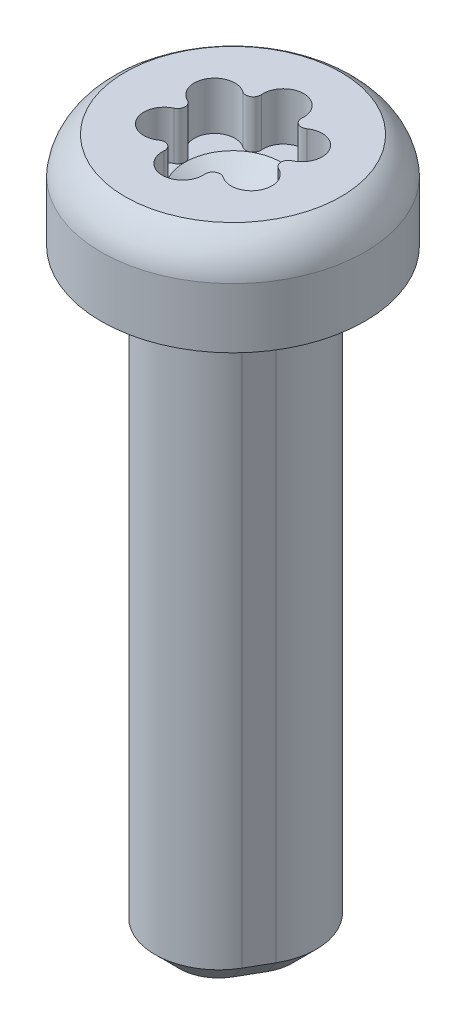
ISO-10303-21;
HEADER;
FILE_DESCRIPTION(('STEP AP214'),'2;1');
FILE_NAME('part.step','',(''),(''),'','','');
FILE_SCHEMA(('AUTOMOTIVE_DESIGN { 1 0 10303 214 1 1 1 1 }'));
ENDSEC;
DATA;
#1=APPLICATION_CONTEXT('core data for automotive mechanical design processes');
#2=APPLICATION_PROTOCOL_DEFINITION('international standard','automotive_design',2000,#1);
#3=PRODUCT_CONTEXT('',#1,'mechanical');
#4=PRODUCT('Part','Part','',(#3));
#5=PRODUCT_RELATED_PRODUCT_CATEGORY('part','',(#4));
#6=PRODUCT_DEFINITION_FORMATION('','',#4);
#7=PRODUCT_DEFINITION_CONTEXT('part definition',#1,'design');
#8=PRODUCT_DEFINITION('design','',#6,#7);
#9=PRODUCT_DEFINITION_SHAPE('','',#8);
#10=(LENGTH_UNIT() NAMED_UNIT(*) SI_UNIT(.MILLI.,.METRE.));
#11=(NAMED_UNIT(*) PLANE_ANGLE_UNIT() SI_UNIT($,.RADIAN.));
#12=(NAMED_UNIT(*) SI_UNIT($,.STERADIAN.) SOLID_ANGLE_UNIT());
#13=UNCERTAINTY_MEASURE_WITH_UNIT(LENGTH_MEASURE(1.E-05),#10,'distance_accuracy_value','');
#14=(GEOMETRIC_REPRESENTATION_CONTEXT(3) GLOBAL_UNCERTAINTY_ASSIGNED_CONTEXT((#13)) GLOBAL_UNIT_ASSIGNED_CONTEXT((#10,
#11,#12)) REPRESENTATION_CONTEXT('',''));
#15=CARTESIAN_POINT('',(0.,0.,0.));
#16=DIRECTION('',(0.,0.,1.));
#17=DIRECTION('',(1.,0.,0.));
#18=AXIS2_PLACEMENT_3D('',#15,#16,#17);
#19=CARTESIAN_POINT('',(0.,-1.13686739848977E-10,0.));
#20=DIRECTION('',(0.,1.,0.));
#21=DIRECTION('',(0.,0.,1.));
#22=AXIS2_PLACEMENT_3D('',#19,#20,#21);
#23=CONICAL_SURFACE('',#22,0.507999999911135,1.0297442581157);
#24=CARTESIAN_POINT('',(0.,-0.30523719459552,0.));
#25=VERTEX_POINT('',#24);
#26=VERTEX_LOOP('',#25);
#27=FACE_BOUND('',#26,.T.);
#28=CARTESIAN_POINT('',(0.,-4.5376796073484E-11,0.));
#29=DIRECTION('',(0.,1.,0.));
#30=DIRECTION('',(0.,0.,1.));
#31=AXIS2_PLACEMENT_3D('',#28,#29,#30);
#32=CIRCLE('',#31,0.508000000024822);
#33=CARTESIAN_POINT('',(0.508000000012404,-2.84168347221045E-11,1.76987610803073E-13));
#34=VERTEX_POINT('',#33);
#35=CARTESIAN_POINT('',(0.254000000006177,-2.26857052065988E-11,0.439940905133282));
#36=VERTEX_POINT('',#35);
#37=EDGE_CURVE('E195',#34,#36,#32,.F.);
#38=ORIENTED_EDGE('',*,*,#37,.F.);
#39=CARTESIAN_POINT('',(0.,-4.5376796073484E-11,0.));
#40=DIRECTION('',(0.,1.,0.));
#41=DIRECTION('',(0.,0.,1.));
#42=AXIS2_PLACEMENT_3D('',#39,#40,#41);
#43=CIRCLE('',#42,0.508000000024822);
#44=CARTESIAN_POINT('',(0.254000000006261,-2.26884398453516E-11,-0.439940905133193));
#45=VERTEX_POINT('',#44);
#46=EDGE_CURVE('E221',#45,#34,#43,.F.);
#47=ORIENTED_EDGE('',*,*,#46,.F.);
#48=CARTESIAN_POINT('',(0.,-4.5376730928045E-11,0.));
#49=DIRECTION('',(0.,1.,0.));
#50=DIRECTION('',(0.,0.,1.));
#51=AXIS2_PLACEMENT_3D('',#48,#49,#50);
#52=CIRCLE('',#51,0.508000000024822);
#53=CARTESIAN_POINT('',(-0.253999999983999,-3.0287031467854E-11,-0.439940905094758));
#54=VERTEX_POINT('',#53);
#55=EDGE_CURVE('E218',#54,#45,#52,.F.);
#56=ORIENTED_EDGE('',*,*,#55,.F.);
#57=CARTESIAN_POINT('',(0.,-1.13686739848977E-10,0.));
#58=DIRECTION('',(0.,1.,0.));
#59=DIRECTION('',(0.,0.,1.));
#60=AXIS2_PLACEMENT_3D('',#57,#58,#59);
#61=CIRCLE('',#60,0.507999999911135);
#62=CARTESIAN_POINT('',(-0.507999999911135,-8.82961703532376E-11,0.));
#63=VERTEX_POINT('',#62);
#64=EDGE_CURVE('E172',#63,#54,#61,.F.);
#65=ORIENTED_EDGE('',*,*,#64,.F.);
#66=CARTESIAN_POINT('',(0.,-4.5376796073484E-11,0.));
#67=DIRECTION('',(0.,1.,0.));
#68=DIRECTION('',(0.,0.,1.));
#69=AXIS2_PLACEMENT_3D('',#66,#67,#68);
#70=CIRCLE('',#69,0.508000000024822);
#71=CARTESIAN_POINT('',(-0.25400000000622,-2.26827183768354E-11,0.439940905133266));
#72=VERTEX_POINT('',#71);
#73=EDGE_CURVE('E18',#72,#63,#70,.F.);
#74=ORIENTED_EDGE('',*,*,#73,.F.);
#75=CARTESIAN_POINT('',(0.,-4.5376796073484E-11,0.));
#76=DIRECTION('',(0.,1.,0.));
#77=DIRECTION('',(0.,0.,1.));
#78=AXIS2_PLACEMENT_3D('',#75,#76,#77);
#79=CIRCLE('',#78,0.508000000024822);
#80=EDGE_CURVE('E169',#36,#72,#79,.F.);
#81=ORIENTED_EDGE('',*,*,#80,.F.);
#82=EDGE_LOOP('',(#38,#47,#56,#65,#74,#81));
#83=FACE_BOUND('',#82,.T.);
#84=ADVANCED_FACE('F15',(#27,#83),#23,.F.);
#85=CARTESIAN_POINT('',(-0.146605300490809,0.,-0.520627829108847));
#86=DIRECTION('',(0.,1.,0.));
#87=DIRECTION('',(-1.,0.,0.));
#88=AXIS2_PLACEMENT_3D('',#85,#86,#87);
#89=PLANE('',#88);
#90=CARTESIAN_POINT('',(-0.461937950378643,0.,0.266700000000102));
#91=DIRECTION('',(0.,1.,0.));
#92=DIRECTION('',(0.,0.,1.));
#93=AXIS2_PLACEMENT_3D('',#90,#91,#92);
#94=CIRCLE('',#93,0.215900000000003);
#95=CARTESIAN_POINT('',(-0.553252928157447,0.,0.0710615967321304));
#96=VERTEX_POINT('',#95);
#97=CARTESIAN_POINT('',(-0.338167612082153,0.,0.443600292136563));
#98=VERTEX_POINT('',#97);
#99=EDGE_CURVE('E180',#96,#98,#94,.T.);
#100=ORIENTED_EDGE('',*,*,#99,.T.);
#101=CARTESIAN_POINT('',(-0.293210600981628,0.,0.507855658218009));
#102=DIRECTION('',(0.,1.,0.));
#103=DIRECTION('',(0.,0.,1.));
#104=AXIS2_PLACEMENT_3D('',#101,#102,#103);
#105=CIRCLE('',#104,0.0784212019632229);
#106=EDGE_CURVE('E178',#72,#98,#105,.T.);
#107=ORIENTED_EDGE('',*,*,#106,.F.);
#108=ORIENTED_EDGE('',*,*,#73,.T.);
#109=CARTESIAN_POINT('',(-0.586421201963143,0.,1.31838984174237E-13));
#110=DIRECTION('',(0.,1.,0.));
#111=DIRECTION('',(0.,0.,1.));
#112=AXIS2_PLACEMENT_3D('',#109,#110,#111);
#113=CIRCLE('',#112,0.0784212019632229);
#114=EDGE_CURVE('E209',#96,#63,#113,.T.);
#115=ORIENTED_EDGE('',*,*,#114,.F.);
#116=EDGE_LOOP('',(#100,#107,#108,#115));
#117=FACE_BOUND('',#116,.T.);
#118=ADVANCED_FACE('F179',(#117),#89,.T.);
#119=CARTESIAN_POINT('',(-0.146605300490809,0.,-0.520627829108847));
#120=DIRECTION('',(0.,1.,0.));
#121=DIRECTION('',(-1.,0.,0.));
#122=AXIS2_PLACEMENT_3D('',#119,#120,#121);
#123=PLANE('',#122);
#124=CARTESIAN_POINT('',(0.,0.,0.533400000000139));
#125=DIRECTION('',(0.,1.,0.));
#126=DIRECTION('',(-1.,0.,0.));
#127=AXIS2_PLACEMENT_3D('',#124,#125,#126);
#128=CIRCLE('',#127,0.215900000000003);
#129=CARTESIAN_POINT('',(-0.215085316075352,0.,0.514661888868534));
#130=VERTEX_POINT('',#129);
#131=CARTESIAN_POINT('',(0.21508531607529,0.,0.514661888868584));
#132=VERTEX_POINT('',#131);
#133=EDGE_CURVE('E201',#130,#132,#128,.T.);
#134=ORIENTED_EDGE('',*,*,#133,.T.);
#135=CARTESIAN_POINT('',(0.293210600981579,0.,0.50785565821802));
#136=DIRECTION('',(0.,1.,0.));
#137=DIRECTION('',(0.,0.,1.));
#138=AXIS2_PLACEMENT_3D('',#135,#136,#137);
#139=CIRCLE('',#138,0.0784212019632229);
#140=EDGE_CURVE('E193',#36,#132,#139,.T.);
#141=ORIENTED_EDGE('',*,*,#140,.F.);
#142=ORIENTED_EDGE('',*,*,#80,.T.);
#143=CARTESIAN_POINT('',(-0.293210600981628,0.,0.507855658218009));
#144=DIRECTION('',(0.,1.,0.));
#145=DIRECTION('',(0.,0.,1.));
#146=AXIS2_PLACEMENT_3D('',#143,#144,#145);
#147=CIRCLE('',#146,0.0784212019632229);
#148=EDGE_CURVE('E191',#130,#72,#147,.T.);
#149=ORIENTED_EDGE('',*,*,#148,.F.);
#150=EDGE_LOOP('',(#134,#141,#142,#149));
#151=FACE_BOUND('',#150,.T.);
#152=ADVANCED_FACE('F190',(#151),#123,.T.);
#153=CARTESIAN_POINT('',(-0.146605300490809,0.,-0.520627829108847));
#154=DIRECTION('',(0.,1.,0.));
#155=DIRECTION('',(-1.,0.,0.));
#156=AXIS2_PLACEMENT_3D('',#153,#154,#155);
#157=PLANE('',#156);
#158=CARTESIAN_POINT('',(0.4619379503786,0.,0.26670000000004));
#159=DIRECTION('',(0.,1.,0.));
#160=DIRECTION('',(0.,0.,1.));
#161=AXIS2_PLACEMENT_3D('',#158,#159,#160);
#162=CIRCLE('',#161,0.215900000000003);
#163=CARTESIAN_POINT('',(0.338167612082105,0.,0.443600292136536));
#164=VERTEX_POINT('',#163);
#165=CARTESIAN_POINT('',(0.553252928157513,0.,0.0710615967320641));
#166=VERTEX_POINT('',#165);
#167=EDGE_CURVE('E240',#164,#166,#162,.T.);
#168=ORIENTED_EDGE('',*,*,#167,.T.);
#169=CARTESIAN_POINT('',(0.586421201963208,0.,0.));
#170=DIRECTION('',(0.,1.,0.));
#171=DIRECTION('',(0.,0.,1.));
#172=AXIS2_PLACEMENT_3D('',#169,#170,#171);
#173=CIRCLE('',#172,0.0784212019632229);
#174=EDGE_CURVE('E231',#34,#166,#173,.T.);
#175=ORIENTED_EDGE('',*,*,#174,.F.);
#176=ORIENTED_EDGE('',*,*,#37,.T.);
#177=CARTESIAN_POINT('',(0.293210600981579,0.,0.50785565821802));
#178=DIRECTION('',(0.,1.,0.));
#179=DIRECTION('',(0.,0.,1.));
#180=AXIS2_PLACEMENT_3D('',#177,#178,#179);
#181=CIRCLE('',#180,0.0784212019632229);
#182=EDGE_CURVE('E228',#164,#36,#181,.T.);
#183=ORIENTED_EDGE('',*,*,#182,.F.);
#184=EDGE_LOOP('',(#168,#175,#176,#183));
#185=FACE_BOUND('',#184,.T.);
#186=ADVANCED_FACE('F227',(#185),#157,.T.);
#187=CARTESIAN_POINT('',(-0.146605300490809,0.,-0.520627829108847));
#188=DIRECTION('',(0.,1.,0.));
#189=DIRECTION('',(-1.,0.,0.));
#190=AXIS2_PLACEMENT_3D('',#187,#188,#189);
#191=PLANE('',#190);
#192=CARTESIAN_POINT('',(0.461937950378598,0.,-0.266699999999932));
#193=DIRECTION('',(0.,1.,0.));
#194=DIRECTION('',(0.,0.,1.));
#195=AXIS2_PLACEMENT_3D('',#192,#193,#194);
#196=CIRCLE('',#195,0.215900000000003);
#197=CARTESIAN_POINT('',(0.553252928157461,0.,-0.0710615967319761));
#198=VERTEX_POINT('',#197);
#199=CARTESIAN_POINT('',(0.338167612082141,0.,-0.443600292136444));
#200=VERTEX_POINT('',#199);
#201=EDGE_CURVE('E251',#198,#200,#196,.T.);
#202=ORIENTED_EDGE('',*,*,#201,.T.);
#203=CARTESIAN_POINT('',(0.293210600981617,0.,-0.507855658217916));
#204=DIRECTION('',(0.,1.,0.));
#205=DIRECTION('',(0.,0.,1.));
#206=AXIS2_PLACEMENT_3D('',#203,#204,#205);
#207=CIRCLE('',#206,0.0784212019632229);
#208=EDGE_CURVE('E253',#45,#200,#207,.T.);
#209=ORIENTED_EDGE('',*,*,#208,.F.);
#210=ORIENTED_EDGE('',*,*,#46,.T.);
#211=CARTESIAN_POINT('',(0.586421201963208,0.,0.));
#212=DIRECTION('',(0.,1.,0.));
#213=DIRECTION('',(0.,0.,1.));
#214=AXIS2_PLACEMENT_3D('',#211,#212,#213);
#215=CIRCLE('',#214,0.0784212019632229);
#216=EDGE_CURVE('E247',#198,#34,#215,.T.);
#217=ORIENTED_EDGE('',*,*,#216,.F.);
#218=EDGE_LOOP('',(#202,#209,#210,#217));
#219=FACE_BOUND('',#218,.T.);
#220=ADVANCED_FACE('F454',(#219),#191,.T.);
#221=CARTESIAN_POINT('',(-0.146605300490809,0.,-0.520627829108847));
#222=DIRECTION('',(0.,1.,0.));
#223=DIRECTION('',(-1.,0.,0.));
#224=AXIS2_PLACEMENT_3D('',#221,#222,#223);
#225=PLANE('',#224);
#226=CARTESIAN_POINT('',(0.,0.,-0.533400000000007));
#227=DIRECTION('',(0.,1.,0.));
#228=DIRECTION('',(-1.,0.,0.));
#229=AXIS2_PLACEMENT_3D('',#226,#227,#228);
#230=CIRCLE('',#229,0.215900000000003);
#231=CARTESIAN_POINT('',(0.215085316075316,0.,-0.514661888868424));
#232=VERTEX_POINT('',#231);
#233=CARTESIAN_POINT('',(-0.215085316075307,0.,-0.514661888868389));
#234=VERTEX_POINT('',#233);
#235=EDGE_CURVE('E260',#232,#234,#230,.T.);
#236=ORIENTED_EDGE('',*,*,#235,.T.);
#237=CARTESIAN_POINT('',(-0.293210600981558,0.,-0.507855658217843));
#238=DIRECTION('',(0.,1.,0.));
#239=DIRECTION('',(0.,0.,1.));
#240=AXIS2_PLACEMENT_3D('',#237,#238,#239);
#241=CIRCLE('',#240,0.0784212019632229);
#242=EDGE_CURVE('E262',#54,#234,#241,.T.);
#243=ORIENTED_EDGE('',*,*,#242,.F.);
#244=ORIENTED_EDGE('',*,*,#55,.T.);
#245=CARTESIAN_POINT('',(0.293210600981617,0.,-0.507855658217916));
#246=DIRECTION('',(0.,1.,0.));
#247=DIRECTION('',(0.,0.,1.));
#248=AXIS2_PLACEMENT_3D('',#245,#246,#247);
#249=CIRCLE('',#248,0.0784212019632229);
#250=EDGE_CURVE('E257',#232,#45,#249,.T.);
#251=ORIENTED_EDGE('',*,*,#250,.F.);
#252=EDGE_LOOP('',(#236,#243,#244,#251));
#253=FACE_BOUND('',#252,.T.);
#254=ADVANCED_FACE('F450',(#253),#225,.T.);
#255=CARTESIAN_POINT('',(-0.146605300490809,0.,-0.520627829108847));
#256=DIRECTION('',(0.,1.,0.));
#257=DIRECTION('',(-1.,0.,0.));
#258=AXIS2_PLACEMENT_3D('',#255,#256,#257);
#259=PLANE('',#258);
#260=CARTESIAN_POINT('',(-0.46193795037861,0.,-0.266699999999995));
#261=DIRECTION('',(0.,1.,0.));
#262=DIRECTION('',(0.,0.,1.));
#263=AXIS2_PLACEMENT_3D('',#260,#261,#262);
#264=CIRCLE('',#263,0.215900000000003);
#265=CARTESIAN_POINT('',(-0.338167612082116,0.,-0.443600292136436));
#266=VERTEX_POINT('',#265);
#267=CARTESIAN_POINT('',(-0.553252928157409,0.,-0.0710615967319348));
#268=VERTEX_POINT('',#267);
#269=EDGE_CURVE('E215',#266,#268,#264,.T.);
#270=ORIENTED_EDGE('',*,*,#269,.T.);
#271=CARTESIAN_POINT('',(-0.586421201963143,0.,1.31838984174237E-13));
#272=DIRECTION('',(0.,1.,0.));
#273=DIRECTION('',(0.,0.,1.));
#274=AXIS2_PLACEMENT_3D('',#271,#272,#273);
#275=CIRCLE('',#274,0.0784212019632229);
#276=EDGE_CURVE('E212',#63,#268,#275,.T.);
#277=ORIENTED_EDGE('',*,*,#276,.F.);
#278=ORIENTED_EDGE('',*,*,#64,.T.);
#279=CARTESIAN_POINT('',(-0.293210600981558,0.,-0.507855658217843));
#280=DIRECTION('',(0.,1.,0.));
#281=DIRECTION('',(0.,0.,1.));
#282=AXIS2_PLACEMENT_3D('',#279,#280,#281);
#283=CIRCLE('',#282,0.0784212019632229);
#284=EDGE_CURVE('E266',#266,#54,#283,.T.);
#285=ORIENTED_EDGE('',*,*,#284,.F.);
#286=EDGE_LOOP('',(#270,#277,#278,#285));
#287=FACE_BOUND('',#286,.T.);
#288=ADVANCED_FACE('F446',(#287),#259,.T.);
#289=CARTESIAN_POINT('',(-0.46193795037861,0.,-0.266699999999995));
#290=DIRECTION('',(0.,1.,0.));
#291=DIRECTION('',(0.,0.,1.));
#292=AXIS2_PLACEMENT_3D('',#289,#290,#291);
#293=CYLINDRICAL_SURFACE('',#292,0.215900000000003);
#294=ORIENTED_EDGE('',*,*,#269,.F.);
#295=DIRECTION('',(0.,1.,0.));
#296=VECTOR('',#295,1.);
#297=CARTESIAN_POINT('',(-0.338167612082161,0.,-0.443600292136426));
#298=LINE('',#297,#296);
#299=CARTESIAN_POINT('',(-0.338167612082136,0.508000000000003,-0.443600292136409));
#300=VERTEX_POINT('',#299);
#301=EDGE_CURVE('E270',#300,#266,#298,.F.);
#302=ORIENTED_EDGE('',*,*,#301,.F.);
#303=CARTESIAN_POINT('',(-0.46193795037861,0.508000000000007,-0.266699999999995));
#304=DIRECTION('',(0.,1.,0.));
#305=DIRECTION('',(0.,0.,1.));
#306=AXIS2_PLACEMENT_3D('',#303,#304,#305);
#307=CIRCLE('',#306,0.215900000000003);
#308=CARTESIAN_POINT('',(-0.55325292815741,0.508000000000008,-0.071061596731935));
#309=VERTEX_POINT('',#308);
#310=EDGE_CURVE('E269',#300,#309,#307,.T.);
#311=ORIENTED_EDGE('',*,*,#310,.T.);
#312=DIRECTION('',(0.,1.,0.));
#313=VECTOR('',#312,1.);
#314=CARTESIAN_POINT('',(-0.553252928157437,0.,-0.0710615967319028));
#315=LINE('',#314,#313);
#316=EDGE_CURVE('E211',#268,#309,#315,.T.);
#317=ORIENTED_EDGE('',*,*,#316,.F.);
#318=EDGE_LOOP('',(#294,#302,#311,#317));
#319=FACE_BOUND('',#318,.T.);
#320=ADVANCED_FACE('F442',(#319),#293,.F.);
#321=CARTESIAN_POINT('',(-0.586421201963143,0.,1.31838984174237E-13));
#322=DIRECTION('',(0.,1.,0.));
#323=DIRECTION('',(0.,0.,1.));
#324=AXIS2_PLACEMENT_3D('',#321,#322,#323);
#325=CYLINDRICAL_SURFACE('',#324,0.0784212019632229);
#326=DIRECTION('',(0.,1.,0.));
#327=VECTOR('',#326,1.);
#328=CARTESIAN_POINT('',(-0.553252928157487,0.,0.0710615967321077));
#329=LINE('',#328,#327);
#330=CARTESIAN_POINT('',(-0.553252928157447,0.508000000000008,0.0710615967321303));
#331=VERTEX_POINT('',#330);
#332=EDGE_CURVE('E208',#331,#96,#329,.F.);
#333=ORIENTED_EDGE('',*,*,#332,.T.);
#334=ORIENTED_EDGE('',*,*,#114,.T.);
#335=ORIENTED_EDGE('',*,*,#276,.T.);
#336=ORIENTED_EDGE('',*,*,#316,.T.);
#337=CARTESIAN_POINT('',(-0.586421201963143,0.508000000000008,1.31685924531615E-13));
#338=DIRECTION('',(0.,1.,0.));
#339=DIRECTION('',(0.,0.,1.));
#340=AXIS2_PLACEMENT_3D('',#337,#338,#339);
#341=CIRCLE('',#340,0.0784212019632229);
#342=EDGE_CURVE('E272',#309,#331,#341,.F.);
#343=ORIENTED_EDGE('',*,*,#342,.T.);
#344=EDGE_LOOP('',(#333,#334,#335,#336,#343));
#345=FACE_BOUND('',#344,.T.);
#346=ADVANCED_FACE('F438',(#345),#325,.T.);
#347=CARTESIAN_POINT('',(-0.461937950378643,0.,0.266700000000102));
#348=DIRECTION('',(0.,1.,0.));
#349=DIRECTION('',(0.,0.,1.));
#350=AXIS2_PLACEMENT_3D('',#347,#348,#349);
#351=CYLINDRICAL_SURFACE('',#350,0.215900000000003);
#352=ORIENTED_EDGE('',*,*,#99,.F.);
#353=ORIENTED_EDGE('',*,*,#332,.F.);
#354=CARTESIAN_POINT('',(-0.461937950378643,0.508000000000004,0.266700000000102));
#355=DIRECTION('',(0.,1.,0.));
#356=DIRECTION('',(0.,0.,1.));
#357=AXIS2_PLACEMENT_3D('',#354,#355,#356);
#358=CIRCLE('',#357,0.215900000000003);
#359=CARTESIAN_POINT('',(-0.338167612082153,0.508000000000004,0.443600292136563));
#360=VERTEX_POINT('',#359);
#361=EDGE_CURVE('E275',#331,#360,#358,.T.);
#362=ORIENTED_EDGE('',*,*,#361,.T.);
#363=DIRECTION('',(0.,1.,0.));
#364=VECTOR('',#363,1.);
#365=CARTESIAN_POINT('',(-0.338167612082163,0.,0.443600292136546));
#366=LINE('',#365,#364);
#367=EDGE_CURVE('E185',#98,#360,#366,.T.);
#368=ORIENTED_EDGE('',*,*,#367,.F.);
#369=EDGE_LOOP('',(#352,#353,#362,#368));
#370=FACE_BOUND('',#369,.T.);
#371=ADVANCED_FACE('F435',(#370),#351,.F.);
#372=CARTESIAN_POINT('',(-0.293210600981628,0.,0.507855658218009));
#373=DIRECTION('',(0.,1.,0.));
#374=DIRECTION('',(0.,0.,1.));
#375=AXIS2_PLACEMENT_3D('',#372,#373,#374);
#376=CYLINDRICAL_SURFACE('',#375,0.0784212019632229);
#377=DIRECTION('',(0.,1.,0.));
#378=VECTOR('',#377,1.);
#379=CARTESIAN_POINT('',(-0.215085316075359,0.,0.514661888868491));
#380=LINE('',#379,#378);
#381=CARTESIAN_POINT('',(-0.215085316075352,0.508000000000008,0.514661888868534));
#382=VERTEX_POINT('',#381);
#383=EDGE_CURVE('E199',#382,#130,#380,.F.);
#384=ORIENTED_EDGE('',*,*,#383,.T.);
#385=ORIENTED_EDGE('',*,*,#148,.T.);
#386=ORIENTED_EDGE('',*,*,#106,.T.);
#387=ORIENTED_EDGE('',*,*,#367,.T.);
#388=CARTESIAN_POINT('',(-0.293210600981628,0.508000000000004,0.507855658218009));
#389=DIRECTION('',(0.,1.,0.));
#390=DIRECTION('',(0.,0.,1.));
#391=AXIS2_PLACEMENT_3D('',#388,#389,#390);
#392=CIRCLE('',#391,0.0784212019632229);
#393=EDGE_CURVE('E277',#360,#382,#392,.F.);
#394=ORIENTED_EDGE('',*,*,#393,.T.);
#395=EDGE_LOOP('',(#384,#385,#386,#387,#394));
#396=FACE_BOUND('',#395,.T.);
#397=ADVANCED_FACE('F196',(#396),#376,.T.);
#398=CARTESIAN_POINT('',(0.,0.,0.533400000000139));
#399=DIRECTION('',(0.,1.,0.));
#400=DIRECTION('',(0.,0.,1.));
#401=AXIS2_PLACEMENT_3D('',#398,#399,#400);
#402=CYLINDRICAL_SURFACE('',#401,0.215900000000003);
#403=ORIENTED_EDGE('',*,*,#133,.F.);
#404=ORIENTED_EDGE('',*,*,#383,.F.);
#405=CARTESIAN_POINT('',(0.,0.507999999999997,0.533400000000139));
#406=DIRECTION('',(0.,1.,0.));
#407=DIRECTION('',(0.,0.,1.));
#408=AXIS2_PLACEMENT_3D('',#405,#406,#407);
#409=CIRCLE('',#408,0.215900000000003);
#410=CARTESIAN_POINT('',(0.21508531607529,0.507999999999997,0.514661888868584));
#411=VERTEX_POINT('',#410);
#412=EDGE_CURVE('E279',#382,#411,#409,.T.);
#413=ORIENTED_EDGE('',*,*,#412,.T.);
#414=DIRECTION('',(0.,1.,0.));
#415=VECTOR('',#414,1.);
#416=CARTESIAN_POINT('',(0.215085316075296,0.,0.514661888868583));
#417=LINE('',#416,#415);
#418=EDGE_CURVE('E242',#132,#411,#417,.T.);
#419=ORIENTED_EDGE('',*,*,#418,.F.);
#420=EDGE_LOOP('',(#403,#404,#413,#419));
#421=FACE_BOUND('',#420,.T.);
#422=ADVANCED_FACE('F429',(#421),#402,.F.);
#423=CARTESIAN_POINT('',(0.293210600981579,0.,0.50785565821802));
#424=DIRECTION('',(0.,1.,0.));
#425=DIRECTION('',(0.,0.,1.));
#426=AXIS2_PLACEMENT_3D('',#423,#424,#425);
#427=CYLINDRICAL_SURFACE('',#426,0.0784212019632229);
#428=DIRECTION('',(0.,1.,0.));
#429=VECTOR('',#428,1.);
#430=CARTESIAN_POINT('',(0.338167612082102,0.,0.443600292136519));
#431=LINE('',#430,#429);
#432=CARTESIAN_POINT('',(0.338167612082105,0.508,0.443600292136535));
#433=VERTEX_POINT('',#432);
#434=EDGE_CURVE('E237',#433,#164,#431,.F.);
#435=ORIENTED_EDGE('',*,*,#434,.T.);
#436=ORIENTED_EDGE('',*,*,#182,.T.);
#437=ORIENTED_EDGE('',*,*,#140,.T.);
#438=ORIENTED_EDGE('',*,*,#418,.T.);
#439=CARTESIAN_POINT('',(0.293210600981579,0.507999999999995,0.50785565821802));
#440=DIRECTION('',(0.,1.,0.));
#441=DIRECTION('',(0.,0.,1.));
#442=AXIS2_PLACEMENT_3D('',#439,#440,#441);
#443=CIRCLE('',#442,0.0784212019632229);
#444=EDGE_CURVE('E282',#411,#433,#443,.F.);
#445=ORIENTED_EDGE('',*,*,#444,.T.);
#446=EDGE_LOOP('',(#435,#436,#437,#438,#445));
#447=FACE_BOUND('',#446,.T.);
#448=ADVANCED_FACE('F234',(#447),#427,.T.);
#449=CARTESIAN_POINT('',(0.4619379503786,0.,0.26670000000004));
#450=DIRECTION('',(0.,1.,0.));
#451=DIRECTION('',(0.,0.,1.));
#452=AXIS2_PLACEMENT_3D('',#449,#450,#451);
#453=CYLINDRICAL_SURFACE('',#452,0.215900000000003);
#454=DIRECTION('',(0.,1.,0.));
#455=VECTOR('',#454,1.);
#456=CARTESIAN_POINT('',(0.553252928157582,0.,0.0710615967320819));
#457=LINE('',#456,#455);
#458=CARTESIAN_POINT('',(0.553252928157513,0.508000000000002,0.0710615967320639));
#459=VERTEX_POINT('',#458);
#460=EDGE_CURVE('E246',#166,#459,#457,.T.);
#461=ORIENTED_EDGE('',*,*,#460,.F.);
#462=ORIENTED_EDGE('',*,*,#167,.F.);
#463=ORIENTED_EDGE('',*,*,#434,.F.);
#464=CARTESIAN_POINT('',(0.461937950378599,0.508000000000002,0.26670000000004));
#465=DIRECTION('',(0.,1.,0.));
#466=DIRECTION('',(0.,0.,1.));
#467=AXIS2_PLACEMENT_3D('',#464,#465,#466);
#468=CIRCLE('',#467,0.215900000000003);
#469=EDGE_CURVE('E284',#433,#459,#468,.T.);
#470=ORIENTED_EDGE('',*,*,#469,.T.);
#471=EDGE_LOOP('',(#461,#462,#463,#470));
#472=FACE_BOUND('',#471,.T.);
#473=ADVANCED_FACE('F422',(#472),#453,.F.);
#474=CARTESIAN_POINT('',(0.586421201963208,0.,0.));
#475=DIRECTION('',(0.,1.,0.));
#476=DIRECTION('',(0.,0.,1.));
#477=AXIS2_PLACEMENT_3D('',#474,#475,#476);
#478=CYLINDRICAL_SURFACE('',#477,0.0784212019632229);
#479=CARTESIAN_POINT('',(0.586421201963208,0.508000000000005,0.));
#480=DIRECTION('',(0.,1.,0.));
#481=DIRECTION('',(0.,0.,1.));
#482=AXIS2_PLACEMENT_3D('',#479,#480,#481);
#483=CIRCLE('',#482,0.0784212019632229);
#484=CARTESIAN_POINT('',(0.553252928157461,0.508000000000008,-0.0710615967319762));
#485=VERTEX_POINT('',#484);
#486=EDGE_CURVE('E287',#459,#485,#483,.F.);
#487=ORIENTED_EDGE('',*,*,#486,.T.);
#488=DIRECTION('',(0.,1.,0.));
#489=VECTOR('',#488,1.);
#490=CARTESIAN_POINT('',(0.553252928157476,0.,-0.0710615967319539));
#491=LINE('',#490,#489);
#492=EDGE_CURVE('E250',#485,#198,#491,.F.);
#493=ORIENTED_EDGE('',*,*,#492,.T.);
#494=ORIENTED_EDGE('',*,*,#216,.T.);
#495=ORIENTED_EDGE('',*,*,#174,.T.);
#496=ORIENTED_EDGE('',*,*,#460,.T.);
#497=EDGE_LOOP('',(#487,#493,#494,#495,#496));
#498=FACE_BOUND('',#497,.T.);
#499=ADVANCED_FACE('F418',(#498),#478,.T.);
#500=CARTESIAN_POINT('',(0.461937950378598,0.,-0.266699999999932));
#501=DIRECTION('',(0.,1.,0.));
#502=DIRECTION('',(0.,0.,1.));
#503=AXIS2_PLACEMENT_3D('',#500,#501,#502);
#504=CYLINDRICAL_SURFACE('',#503,0.215900000000003);
#505=DIRECTION('',(0.,1.,0.));
#506=VECTOR('',#505,1.);
#507=CARTESIAN_POINT('',(0.338167612082141,0.,-0.443600292136444));
#508=LINE('',#507,#506);
#509=CARTESIAN_POINT('',(0.338167612082141,0.50800000000001,-0.443600292136442));
#510=VERTEX_POINT('',#509);
#511=EDGE_CURVE('E256',#200,#510,#508,.T.);
#512=ORIENTED_EDGE('',*,*,#511,.F.);
#513=ORIENTED_EDGE('',*,*,#201,.F.);
#514=ORIENTED_EDGE('',*,*,#492,.F.);
#515=CARTESIAN_POINT('',(0.461937950378598,0.50800000000001,-0.266699999999932));
#516=DIRECTION('',(0.,1.,0.));
#517=DIRECTION('',(0.,0.,1.));
#518=AXIS2_PLACEMENT_3D('',#515,#516,#517);
#519=CIRCLE('',#518,0.215900000000003);
#520=EDGE_CURVE('E289',#485,#510,#519,.T.);
#521=ORIENTED_EDGE('',*,*,#520,.T.);
#522=EDGE_LOOP('',(#512,#513,#514,#521));
#523=FACE_BOUND('',#522,.T.);
#524=ADVANCED_FACE('F414',(#523),#504,.F.);
#525=CARTESIAN_POINT('',(0.293210600981617,0.,-0.507855658217916));
#526=DIRECTION('',(0.,1.,0.));
#527=DIRECTION('',(0.,0.,1.));
#528=AXIS2_PLACEMENT_3D('',#525,#526,#527);
#529=CYLINDRICAL_SURFACE('',#528,0.0784212019632229);
#530=CARTESIAN_POINT('',(0.293210600981617,0.50800000000001,-0.507855658217916));
#531=DIRECTION('',(0.,1.,0.));
#532=DIRECTION('',(0.,0.,1.));
#533=AXIS2_PLACEMENT_3D('',#530,#531,#532);
#534=CIRCLE('',#533,0.0784212019632229);
#535=CARTESIAN_POINT('',(0.215085316075316,0.508000000000004,-0.514661888868424));
#536=VERTEX_POINT('',#535);
#537=EDGE_CURVE('E292',#510,#536,#534,.F.);
#538=ORIENTED_EDGE('',*,*,#537,.T.);
#539=DIRECTION('',(0.,1.,0.));
#540=VECTOR('',#539,1.);
#541=CARTESIAN_POINT('',(0.215085316075298,0.,-0.514661888868375));
#542=LINE('',#541,#540);
#543=EDGE_CURVE('E259',#536,#232,#542,.F.);
#544=ORIENTED_EDGE('',*,*,#543,.T.);
#545=ORIENTED_EDGE('',*,*,#250,.T.);
#546=ORIENTED_EDGE('',*,*,#208,.T.);
#547=ORIENTED_EDGE('',*,*,#511,.T.);
#548=EDGE_LOOP('',(#538,#544,#545,#546,#547));
#549=FACE_BOUND('',#548,.T.);
#550=ADVANCED_FACE('F410',(#549),#529,.T.);
#551=CARTESIAN_POINT('',(0.,0.,-0.533400000000007));
#552=DIRECTION('',(0.,1.,0.));
#553=DIRECTION('',(0.,0.,1.));
#554=AXIS2_PLACEMENT_3D('',#551,#552,#553);
#555=CYLINDRICAL_SURFACE('',#554,0.215900000000003);
#556=ORIENTED_EDGE('',*,*,#235,.F.);
#557=ORIENTED_EDGE('',*,*,#543,.F.);
#558=CARTESIAN_POINT('',(0.,0.508000000000007,-0.533400000000007));
#559=DIRECTION('',(0.,1.,0.));
#560=DIRECTION('',(0.,0.,1.));
#561=AXIS2_PLACEMENT_3D('',#558,#559,#560);
#562=CIRCLE('',#561,0.215900000000003);
#563=CARTESIAN_POINT('',(-0.215085316075307,0.508000000000007,-0.514661888868389));
#564=VERTEX_POINT('',#563);
#565=EDGE_CURVE('E295',#536,#564,#562,.T.);
#566=ORIENTED_EDGE('',*,*,#565,.T.);
#567=DIRECTION('',(0.,1.,0.));
#568=VECTOR('',#567,1.);
#569=CARTESIAN_POINT('',(-0.215085316075271,0.,-0.514661888868363));
#570=LINE('',#569,#568);
#571=EDGE_CURVE('E265',#234,#564,#570,.T.);
#572=ORIENTED_EDGE('',*,*,#571,.F.);
#573=EDGE_LOOP('',(#556,#557,#566,#572));
#574=FACE_BOUND('',#573,.T.);
#575=ADVANCED_FACE('F406',(#574),#555,.F.);
#576=CARTESIAN_POINT('',(-0.293210600981558,0.,-0.507855658217843));
#577=DIRECTION('',(0.,1.,0.));
#578=DIRECTION('',(0.,0.,1.));
#579=AXIS2_PLACEMENT_3D('',#576,#577,#578);
#580=CYLINDRICAL_SURFACE('',#579,0.0784212019632229);
#581=ORIENTED_EDGE('',*,*,#301,.T.);
#582=ORIENTED_EDGE('',*,*,#284,.T.);
#583=ORIENTED_EDGE('',*,*,#242,.T.);
#584=ORIENTED_EDGE('',*,*,#571,.T.);
#585=CARTESIAN_POINT('',(-0.293210600981558,0.508000000000007,-0.507855658217843));
#586=DIRECTION('',(0.,1.,0.));
#587=DIRECTION('',(0.,0.,1.));
#588=AXIS2_PLACEMENT_3D('',#585,#586,#587);
#589=CIRCLE('',#588,0.0784212019632229);
#590=EDGE_CURVE('E297',#564,#300,#589,.F.);
#591=ORIENTED_EDGE('',*,*,#590,.T.);
#592=EDGE_LOOP('',(#581,#582,#583,#584,#591));
#593=FACE_BOUND('',#592,.T.);
#594=ADVANCED_FACE('F402',(#593),#580,.T.);
#595=CARTESIAN_POINT('',(0.508000000000038,0.508000000000003,1.45716771982052E-13));
#596=DIRECTION('',(0.,-1.,0.));
#597=DIRECTION('',(1.,0.,0.));
#598=AXIS2_PLACEMENT_3D('',#595,#596,#597);
#599=PLANE('',#598);
#600=CARTESIAN_POINT('',(0.,0.508000000000003,0.));
#601=DIRECTION('',(0.,1.,0.));
#602=DIRECTION('',(0.,0.,1.));
#603=AXIS2_PLACEMENT_3D('',#600,#601,#602);
#604=CIRCLE('',#603,1.143);
#605=CARTESIAN_POINT('',(0.,0.508000000000003,1.14300000000001));
#606=VERTEX_POINT('',#605);
#607=EDGE_CURVE('E301',#606,#606,#604,.F.);
#608=ORIENTED_EDGE('',*,*,#607,.F.);
#609=EDGE_LOOP('',(#608));
#610=FACE_BOUND('',#609,.T.);
#611=ORIENTED_EDGE('',*,*,#565,.F.);
#612=ORIENTED_EDGE('',*,*,#537,.F.);
#613=ORIENTED_EDGE('',*,*,#520,.F.);
#614=ORIENTED_EDGE('',*,*,#486,.F.);
#615=ORIENTED_EDGE('',*,*,#469,.F.);
#616=ORIENTED_EDGE('',*,*,#444,.F.);
#617=ORIENTED_EDGE('',*,*,#412,.F.);
#618=ORIENTED_EDGE('',*,*,#393,.F.);
#619=ORIENTED_EDGE('',*,*,#361,.F.);
#620=ORIENTED_EDGE('',*,*,#342,.F.);
#621=ORIENTED_EDGE('',*,*,#310,.F.);
#622=ORIENTED_EDGE('',*,*,#590,.F.);
#623=EDGE_LOOP('',(#611,#612,#613,#614,#615,#616,#617,#618,#619,#620,#621,#622));
#624=FACE_BOUND('',#623,.T.);
#625=ADVANCED_FACE('F398',(#610,#624),#599,.F.);
#626=CARTESIAN_POINT('',(-0.582921699287352,-6.85799999999999,0.488950000000168));
#627=DIRECTION('',(0.866025403784445,0.,-0.499999999999989));
#628=DIRECTION('',(-0.499999999999989,0.,-0.866025403784445));
#629=AXIS2_PLACEMENT_3D('',#626,#627,#628);
#630=PLANE('',#629);
#631=DIRECTION('',(0.499999999999954,0.,0.866025403784465));
#632=VECTOR('',#631,1.);
#633=CARTESIAN_POINT('',(-0.714903970824053,-6.60399999999997,0.260350000000135));
#634=LINE('',#633,#632);
#635=CARTESIAN_POINT('',(-0.714903970824002,-6.60399999999999,0.260350000000105));
#636=VERTEX_POINT('',#635);
#637=CARTESIAN_POINT('',(-0.58292169929885,-6.60399999999539,0.488950000001234));
#638=VERTEX_POINT('',#637);
#639=EDGE_CURVE('E349',#636,#638,#634,.T.);
#640=ORIENTED_EDGE('',*,*,#639,.T.);
#641=DIRECTION('',(0.,1.,0.));
#642=VECTOR('',#641,1.);
#643=CARTESIAN_POINT('',(-0.582921699287339,-6.858,0.488950000000064));
#644=LINE('',#643,#642);
#645=CARTESIAN_POINT('',(-0.582921699287366,-0.507999999999998,0.488950000000081));
#646=VERTEX_POINT('',#645);
#647=EDGE_CURVE('E304',#646,#638,#644,.F.);
#648=ORIENTED_EDGE('',*,*,#647,.F.);
#649=DIRECTION('',(-0.499999999999989,0.,-0.866025403784445));
#650=VECTOR('',#649,1.);
#651=CARTESIAN_POINT('',(-0.582921699287351,-0.507999999999989,0.488950000000168));
#652=LINE('',#651,#650);
#653=CARTESIAN_POINT('',(-0.71490397082401,-0.507999999999993,0.260350000000145));
#654=VERTEX_POINT('',#653);
#655=EDGE_CURVE('E300',#654,#646,#652,.F.);
#656=ORIENTED_EDGE('',*,*,#655,.F.);
#657=DIRECTION('',(0.,1.,0.));
#658=VECTOR('',#657,1.);
#659=CARTESIAN_POINT('',(-0.714903970823951,-6.858,0.260350000000076));
#660=LINE('',#659,#658);
#661=EDGE_CURVE('E305',#636,#654,#660,.T.);
#662=ORIENTED_EDGE('',*,*,#661,.F.);
#663=EDGE_LOOP('',(#640,#648,#656,#662));
#664=FACE_BOUND('',#663,.T.);
#665=ADVANCED_FACE('F394',(#664),#630,.F.);
#666=CARTESIAN_POINT('',(-0.362951246726011,-6.85799999999998,0.361950000000187));
#667=DIRECTION('',(0.61237243569579,0.707106781186549,-0.353553390593279));
#668=DIRECTION('',(-0.755928946018457,0.654653670707974,0.));
#669=AXIS2_PLACEMENT_3D('',#666,#667,#668);
#670=PLANE('',#669);
#671=DIRECTION('',(0.499999999999863,0.,0.866025403784518));
#672=VECTOR('',#671,1.);
#673=CARTESIAN_POINT('',(-0.494933518262778,-6.858,0.133350000000178));
#674=LINE('',#673,#672);
#675=CARTESIAN_POINT('',(-0.494933518288398,-6.8579999999704,0.13335000001497));
#676=VERTEX_POINT('',#675);
#677=CARTESIAN_POINT('',(-0.362951246718506,-6.85800000000601,0.361949999998049));
#678=VERTEX_POINT('',#677);
#679=EDGE_CURVE('E313',#676,#678,#674,.T.);
#680=ORIENTED_EDGE('',*,*,#679,.T.);
#681=DIRECTION('',(0.612372435695783,-0.707106781186549,-0.35355339059329));
#682=VECTOR('',#681,1.);
#683=CARTESIAN_POINT('',(-432146.676488428,498992.722900002,249500.152400012));
#684=LINE('',#683,#682);
#685=EDGE_CURVE('E357',#638,#678,#684,.T.);
#686=ORIENTED_EDGE('',*,*,#685,.F.);
#687=ORIENTED_EDGE('',*,*,#639,.F.);
#688=DIRECTION('',(-0.612372435695868,0.707106781186545,0.353553390593151));
#689=VECTOR('',#688,1.);
#690=CARTESIAN_POINT('',(-0.494933518262777,-6.85799999999997,0.133350000000178));
#691=LINE('',#690,#689);
#692=EDGE_CURVE('E352',#676,#636,#691,.T.);
#693=ORIENTED_EDGE('',*,*,#692,.F.);
#694=EDGE_LOOP('',(#680,#686,#687,#693));
#695=FACE_BOUND('',#694,.T.);
#696=ADVANCED_FACE('F390',(#695),#670,.F.);
#697=CARTESIAN_POINT('',(0.,-6.60400000003847,0.152400000000073));
#698=DIRECTION('',(0.,1.,0.));
#699=DIRECTION('',(0.,0.,1.));
#700=AXIS2_PLACEMENT_3D('',#697,#698,#699);
#701=CONICAL_SURFACE('',#700,0.673099999971762,0.785398163397448);
#702=DIRECTION('',(0.61237243569568,0.707106781186547,0.353553390593473));
#703=VECTOR('',#702,1.);
#704=CARTESIAN_POINT('',(0.362951246725991,-6.858,0.36195000000008));
#705=LINE('',#704,#703);
#706=CARTESIAN_POINT('',(0.362951246737955,-6.85799999998618,0.361950000006987));
#707=VERTEX_POINT('',#706);
#708=CARTESIAN_POINT('',(0.582921699287226,-6.60399999999998,0.488950000000168));
#709=VERTEX_POINT('',#708);
#710=EDGE_CURVE('E309',#707,#709,#705,.T.);
#711=ORIENTED_EDGE('',*,*,#710,.T.);
#712=CARTESIAN_POINT('',(0.,-6.60399999999999,0.152400000000073));
#713=DIRECTION('',(0.,1.,0.));
#714=DIRECTION('',(0.,0.,1.));
#715=AXIS2_PLACEMENT_3D('',#712,#713,#714);
#716=CIRCLE('',#715,0.673100000000007);
#717=EDGE_CURVE('E310',#638,#709,#716,.T.);
#718=ORIENTED_EDGE('',*,*,#717,.F.);
#719=ORIENTED_EDGE('',*,*,#685,.T.);
#720=CARTESIAN_POINT('',(0.,-6.85799999997237,0.152400000000073));
#721=DIRECTION('',(0.,1.,0.));
#722=DIRECTION('',(0.,0.,1.));
#723=AXIS2_PLACEMENT_3D('',#720,#721,#722);
#724=CIRCLE('',#723,0.419100000037863);
#725=EDGE_CURVE('E314',#678,#707,#724,.T.);
#726=ORIENTED_EDGE('',*,*,#725,.T.);
#727=EDGE_LOOP('',(#711,#718,#719,#726));
#728=FACE_BOUND('',#727,.T.);
#729=ADVANCED_FACE('F386',(#728),#701,.T.);
#730=CARTESIAN_POINT('',(-0.131982271536603,-6.60399999998162,-0.0761999999998633));
#731=DIRECTION('',(0.,1.,0.));
#732=DIRECTION('',(0.,0.,1.));
#733=AXIS2_PLACEMENT_3D('',#730,#731,#732);
#734=CONICAL_SURFACE('',#733,0.673100000117497,0.785398163509345);
#735=CARTESIAN_POINT('',(-0.131982271536603,-6.60399999999999,-0.0761999999998633));
#736=DIRECTION('',(0.,1.,0.));
#737=DIRECTION('',(0.,0.,1.));
#738=AXIS2_PLACEMENT_3D('',#735,#736,#737);
#739=CIRCLE('',#738,0.673100000000006);
#740=CARTESIAN_POINT('',(-0.13198227153673,-6.604,-0.74929999999984));
#741=VERTEX_POINT('',#740);
#742=EDGE_CURVE('E320',#741,#636,#739,.T.);
#743=ORIENTED_EDGE('',*,*,#742,.F.);
#744=DIRECTION('',(0.,-0.707106781186543,0.707106781186552));
#745=VECTOR('',#744,1.);
#746=CARTESIAN_POINT('',(-0.131982271536697,-6.85799999999999,-0.495299999999862));
#747=LINE('',#746,#745);
#748=CARTESIAN_POINT('',(-0.131982271536697,-6.8580000000112,-0.495299999988646));
#749=VERTEX_POINT('',#748);
#750=EDGE_CURVE('E547',#741,#749,#747,.T.);
#751=ORIENTED_EDGE('',*,*,#750,.T.);
#752=CARTESIAN_POINT('',(-0.131982271536603,-6.8579999999408,-0.0761999999998633));
#753=DIRECTION('',(0.,1.,0.));
#754=DIRECTION('',(0.,0.,1.));
#755=AXIS2_PLACEMENT_3D('',#752,#753,#754);
#756=CIRCLE('',#755,0.41910000010148);
#757=EDGE_CURVE('E311',#749,#676,#756,.T.);
#758=ORIENTED_EDGE('',*,*,#757,.T.);
#759=ORIENTED_EDGE('',*,*,#692,.T.);
#760=EDGE_LOOP('',(#743,#751,#758,#759));
#761=FACE_BOUND('',#760,.T.);
#762=ADVANCED_FACE('F381',(#761),#734,.T.);
#763=CARTESIAN_POINT('',(0.,0.0659541638342873,0.));
#764=DIRECTION('',(0.,1.,0.));
#765=DIRECTION('',(-1.,0.,0.));
#766=AXIS2_PLACEMENT_3D('',#763,#764,#765);
#767=TOROIDAL_SURFACE('',#766,0.892681245751431,0.508);
#768=ORIENTED_EDGE('',*,*,#607,.T.);
#769=EDGE_LOOP('',(#768));
#770=FACE_BOUND('',#769,.T.);
#771=CARTESIAN_POINT('',(-1.0222701247915E-13,0.127,0.));
#772=DIRECTION('',(0.,1.,0.));
#773=DIRECTION('',(0.,0.,1.));
#774=AXIS2_PLACEMENT_3D('',#771,#772,#773);
#775=CIRCLE('',#774,1.39700000000002);
#776=CARTESIAN_POINT('',(-1.0222701247915E-13,0.127000000000001,1.39700000000009));
#777=VERTEX_POINT('',#776);
#778=EDGE_CURVE('E373',#777,#777,#775,.F.);
#779=ORIENTED_EDGE('',*,*,#778,.F.);
#780=EDGE_LOOP('',(#779));
#781=FACE_BOUND('',#780,.T.);
#782=ADVANCED_FACE('F376',(#770,#781),#767,.T.);
#783=CARTESIAN_POINT('',(0.,-6.858,0.152400000000073));
#784=DIRECTION('',(0.,1.,0.));
#785=DIRECTION('',(0.,0.,1.));
#786=AXIS2_PLACEMENT_3D('',#783,#784,#785);
#787=CYLINDRICAL_SURFACE('',#786,0.673100000000007);
#788=DIRECTION('',(0.,1.,0.));
#789=VECTOR('',#788,1.);
#790=CARTESIAN_POINT('',(0.582921699287209,-6.858,0.488950000000158));
#791=LINE('',#790,#789);
#792=CARTESIAN_POINT('',(0.582921699287213,-0.507999999999998,0.488950000000146));
#793=VERTEX_POINT('',#792);
#794=EDGE_CURVE('E525',#709,#793,#791,.T.);
#795=ORIENTED_EDGE('',*,*,#794,.T.);
#796=CARTESIAN_POINT('',(0.,-0.507999999999998,0.152400000000071));
#797=DIRECTION('',(0.,1.,0.));
#798=DIRECTION('',(0.,0.,1.));
#799=AXIS2_PLACEMENT_3D('',#796,#797,#798);
#800=CIRCLE('',#799,0.673100000000007);
#801=EDGE_CURVE('E306',#793,#646,#800,.F.);
#802=ORIENTED_EDGE('',*,*,#801,.T.);
#803=ORIENTED_EDGE('',*,*,#647,.T.);
#804=ORIENTED_EDGE('',*,*,#717,.T.);
#805=EDGE_LOOP('',(#795,#802,#803,#804));
#806=FACE_BOUND('',#805,.T.);
#807=ADVANCED_FACE('F380',(#806),#787,.T.);
#808=CARTESIAN_POINT('',(0.362951246725991,-6.858,0.36195000000008));
#809=DIRECTION('',(-0.612372435695793,0.707106781186548,-0.353553390593274));
#810=DIRECTION('',(-0.755928946018456,-0.654653670707976,0.));
#811=AXIS2_PLACEMENT_3D('',#808,#809,#810);
#812=PLANE('',#811);
#813=DIRECTION('',(-0.500000000000005,0.,0.866025403784435));
#814=VECTOR('',#813,1.);
#815=CARTESIAN_POINT('',(0.714903970824051,-6.604,0.26035));
#816=LINE('',#815,#814);
#817=CARTESIAN_POINT('',(0.7149039708578,-6.60399999996698,0.26035000001905));
#818=VERTEX_POINT('',#817);
#819=EDGE_CURVE('E517',#818,#709,#816,.T.);
#820=ORIENTED_EDGE('',*,*,#819,.T.);
#821=ORIENTED_EDGE('',*,*,#710,.F.);
#822=DIRECTION('',(0.500000000000238,0.,-0.866025403784301));
#823=VECTOR('',#822,1.);
#824=CARTESIAN_POINT('',(0.362951246725991,-6.858,0.36195000000008));
#825=LINE('',#824,#823);
#826=CARTESIAN_POINT('',(0.494933518272087,-6.85800000002183,0.133349999986226));
#827=VERTEX_POINT('',#826);
#828=EDGE_CURVE('E316',#707,#827,#825,.T.);
#829=ORIENTED_EDGE('',*,*,#828,.T.);
#830=DIRECTION('',(-0.612372435695785,-0.707106781186549,-0.353553390593288));
#831=VECTOR('',#830,1.);
#832=CARTESIAN_POINT('',(432146.9227707,498992.854882273,249499.989791146));
#833=LINE('',#832,#831);
#834=EDGE_CURVE('E325',#818,#827,#833,.T.);
#835=ORIENTED_EDGE('',*,*,#834,.F.);
#836=EDGE_LOOP('',(#820,#821,#829,#835));
#837=FACE_BOUND('',#836,.T.);
#838=ADVANCED_FACE('F505',(#837),#812,.F.);
#839=CARTESIAN_POINT('',(0.,-6.858,0.152400000000073));
#840=DIRECTION('',(0.,1.,0.));
#841=DIRECTION('',(-1.,0.,0.));
#842=AXIS2_PLACEMENT_3D('',#839,#840,#841);
#843=PLANE('',#842);
#844=ORIENTED_EDGE('',*,*,#828,.F.);
#845=ORIENTED_EDGE('',*,*,#725,.F.);
#846=ORIENTED_EDGE('',*,*,#679,.F.);
#847=ORIENTED_EDGE('',*,*,#757,.F.);
#848=DIRECTION('',(1.,0.,0.));
#849=VECTOR('',#848,1.);
#850=CARTESIAN_POINT('',(0.,-6.85799999999995,-0.495299999999898));
#851=LINE('',#850,#849);
#852=CARTESIAN_POINT('',(0.131982271536835,-6.85800000003243,-0.49529999996535));
#853=VERTEX_POINT('',#852);
#854=EDGE_CURVE('E319',#749,#853,#851,.T.);
#855=ORIENTED_EDGE('',*,*,#854,.T.);
#856=CARTESIAN_POINT('',(0.131982271536817,-6.85800000003243,-0.0761999999998529));
#857=DIRECTION('',(0.,1.,0.));
#858=DIRECTION('',(0.,0.,1.));
#859=AXIS2_PLACEMENT_3D('',#856,#857,#858);
#860=CIRCLE('',#859,0.419099999946002);
#861=EDGE_CURVE('E321',#827,#853,#860,.T.);
#862=ORIENTED_EDGE('',*,*,#861,.F.);
#863=EDGE_LOOP('',(#844,#845,#846,#847,#855,#862));
#864=FACE_BOUND('',#863,.T.);
#865=ADVANCED_FACE('F502',(#864),#843,.F.);
#866=CARTESIAN_POINT('',(-0.131982271536603,-6.858,-0.0761999999998632));
#867=DIRECTION('',(0.,1.,0.));
#868=DIRECTION('',(0.,0.,1.));
#869=AXIS2_PLACEMENT_3D('',#866,#867,#868);
#870=CYLINDRICAL_SURFACE('',#869,0.673100000000006);
#871=CARTESIAN_POINT('',(-0.131982271536604,-0.507999999999997,-0.0761999999998651));
#872=DIRECTION('',(0.,1.,0.));
#873=DIRECTION('',(0.,0.,1.));
#874=AXIS2_PLACEMENT_3D('',#871,#872,#873);
#875=CIRCLE('',#874,0.673100000000006);
#876=CARTESIAN_POINT('',(-0.131982271536673,-0.507999999999997,-0.749299999999891));
#877=VERTEX_POINT('',#876);
#878=EDGE_CURVE('E317',#654,#877,#875,.F.);
#879=ORIENTED_EDGE('',*,*,#878,.T.);
#880=DIRECTION('',(0.,1.,0.));
#881=VECTOR('',#880,1.);
#882=CARTESIAN_POINT('',(-0.131982271536742,-6.85799999999999,-0.749299999999824));
#883=LINE('',#882,#881);
#884=EDGE_CURVE('E324',#877,#741,#883,.F.);
#885=ORIENTED_EDGE('',*,*,#884,.T.);
#886=ORIENTED_EDGE('',*,*,#742,.T.);
#887=ORIENTED_EDGE('',*,*,#661,.T.);
#888=EDGE_LOOP('',(#879,#885,#886,#887));
#889=FACE_BOUND('',#888,.T.);
#890=ADVANCED_FACE('F498',(#889),#870,.T.);
#891=CARTESIAN_POINT('',(0.,-6.85799999999999,-0.495299999999862));
#892=DIRECTION('',(0.,0.707106781186552,0.707106781186543));
#893=DIRECTION('',(0.,-0.707106781186543,0.707106781186552));
#894=AXIS2_PLACEMENT_3D('',#891,#892,#893);
#895=PLANE('',#894);
#896=DIRECTION('',(1.,0.,0.));
#897=VECTOR('',#896,1.);
#898=CARTESIAN_POINT('',(-0.131982271536657,-6.60399999999999,-0.749299999999824));
#899=LINE('',#898,#897);
#900=CARTESIAN_POINT('',(0.131982271536817,-6.60400000000961,-0.749299999984526));
#901=VERTEX_POINT('',#900);
#902=EDGE_CURVE('E328',#741,#901,#899,.T.);
#903=ORIENTED_EDGE('',*,*,#902,.T.);
#904=DIRECTION('',(0.,-0.707106781186548,0.707106781186547));
#905=VECTOR('',#904,1.);
#906=CARTESIAN_POINT('',(0.131982312651677,498992.854882273,-499000.208182272));
#907=LINE('',#906,#905);
#908=EDGE_CURVE('E534',#853,#901,#907,.F.);
#909=ORIENTED_EDGE('',*,*,#908,.F.);
#910=ORIENTED_EDGE('',*,*,#854,.F.);
#911=ORIENTED_EDGE('',*,*,#750,.F.);
#912=EDGE_LOOP('',(#903,#909,#910,#911));
#913=FACE_BOUND('',#912,.T.);
#914=ADVANCED_FACE('F494',(#913),#895,.F.);
#915=CARTESIAN_POINT('',(-1.02348685082632E-13,0.758531785788406,0.));
#916=DIRECTION('',(0.,1.,0.));
#917=DIRECTION('',(0.,0.,1.));
#918=AXIS2_PLACEMENT_3D('',#915,#916,#917);
#919=CYLINDRICAL_SURFACE('',#918,1.39700000000002);
#920=ORIENTED_EDGE('',*,*,#778,.T.);
#921=EDGE_LOOP('',(#920));
#922=FACE_BOUND('',#921,.T.);
#923=CARTESIAN_POINT('',(-1.0210467168024E-13,-0.507999999999998,0.));
#924=DIRECTION('',(0.,1.,0.));
#925=DIRECTION('',(0.,0.,1.));
#926=AXIS2_PLACEMENT_3D('',#923,#924,#925);
#927=CIRCLE('',#926,1.39700000000002);
#928=CARTESIAN_POINT('',(-1.0210467168024E-13,-0.507999999999997,1.39700000000009));
#929=VERTEX_POINT('',#928);
#930=EDGE_CURVE('E326',#929,#929,#927,.T.);
#931=ORIENTED_EDGE('',*,*,#930,.T.);
#932=EDGE_LOOP('',(#931));
#933=FACE_BOUND('',#932,.T.);
#934=ADVANCED_FACE('F490',(#922,#933),#919,.T.);
#935=CARTESIAN_POINT('',(0.714903970824051,-6.858,0.260349999999999));
#936=DIRECTION('',(-0.866025403784435,0.,-0.500000000000005));
#937=DIRECTION('',(-0.500000000000005,0.,0.866025403784435));
#938=AXIS2_PLACEMENT_3D('',#935,#936,#937);
#939=PLANE('',#938);
#940=ORIENTED_EDGE('',*,*,#819,.F.);
#941=DIRECTION('',(0.,1.,0.));
#942=VECTOR('',#941,1.);
#943=CARTESIAN_POINT('',(0.714903970824155,-6.85799999999999,0.260350000000104));
#944=LINE('',#943,#942);
#945=CARTESIAN_POINT('',(0.714903970824068,-0.507999999999996,0.260350000000135));
#946=VERTEX_POINT('',#945);
#947=EDGE_CURVE('E580',#946,#818,#944,.F.);
#948=ORIENTED_EDGE('',*,*,#947,.F.);
#949=DIRECTION('',(-0.500000000000113,0.,0.866025403784373));
#950=VECTOR('',#949,1.);
#951=CARTESIAN_POINT('',(0.714903970824054,-0.507999999999998,0.260350000000045));
#952=LINE('',#951,#950);
#953=EDGE_CURVE('E533',#946,#793,#952,.T.);
#954=ORIENTED_EDGE('',*,*,#953,.T.);
#955=ORIENTED_EDGE('',*,*,#794,.F.);
#956=EDGE_LOOP('',(#940,#948,#954,#955));
#957=FACE_BOUND('',#956,.T.);
#958=ADVANCED_FACE('F486',(#957),#939,.F.);
#959=CARTESIAN_POINT('',(0.131982271536817,-6.60400000003847,-0.0761999999998529));
#960=DIRECTION('',(0.,1.,0.));
#961=DIRECTION('',(0.,0.,1.));
#962=AXIS2_PLACEMENT_3D('',#959,#960,#961);
#963=CONICAL_SURFACE('',#962,0.673099999939968,0.785398163397448);
#964=ORIENTED_EDGE('',*,*,#834,.T.);
#965=ORIENTED_EDGE('',*,*,#861,.T.);
#966=ORIENTED_EDGE('',*,*,#908,.T.);
#967=CARTESIAN_POINT('',(0.131982271536817,-6.604,-0.0761999999998529));
#968=DIRECTION('',(0.,1.,0.));
#969=DIRECTION('',(0.,0.,1.));
#970=AXIS2_PLACEMENT_3D('',#967,#968,#969);
#971=CIRCLE('',#970,0.673100000000006);
#972=EDGE_CURVE('E569',#818,#901,#971,.T.);
#973=ORIENTED_EDGE('',*,*,#972,.F.);
#974=EDGE_LOOP('',(#964,#965,#966,#973));
#975=FACE_BOUND('',#974,.T.);
#976=ADVANCED_FACE('F483',(#975),#963,.T.);
#977=CARTESIAN_POINT('',(-0.131982271536657,-6.85799999999999,-0.749299999999824));
#978=DIRECTION('',(0.,0.,1.));
#979=DIRECTION('',(1.,0.,0.));
#980=AXIS2_PLACEMENT_3D('',#977,#978,#979);
#981=PLANE('',#980);
#982=ORIENTED_EDGE('',*,*,#902,.F.);
#983=ORIENTED_EDGE('',*,*,#884,.F.);
#984=DIRECTION('',(-1.,0.,0.));
#985=VECTOR('',#984,1.);
#986=CARTESIAN_POINT('',(0.,-0.507999999999998,-0.74929999999996));
#987=LINE('',#986,#985);
#988=CARTESIAN_POINT('',(0.131982271536807,-0.507999999999996,-0.74929999999991));
#989=VERTEX_POINT('',#988);
#990=EDGE_CURVE('E33',#877,#989,#987,.F.);
#991=ORIENTED_EDGE('',*,*,#990,.T.);
#992=DIRECTION('',(0.,1.,0.));
#993=VECTOR('',#992,1.);
#994=CARTESIAN_POINT('',(0.131982271536799,-6.85799999999999,-0.749299999999859));
#995=LINE('',#994,#993);
#996=EDGE_CURVE('E24',#901,#989,#995,.T.);
#997=ORIENTED_EDGE('',*,*,#996,.F.);
#998=EDGE_LOOP('',(#982,#983,#991,#997));
#999=FACE_BOUND('',#998,.T.);
#1000=ADVANCED_FACE('F476',(#999),#981,.F.);
#1001=CARTESIAN_POINT('',(0.,-0.507999999999998,0.));
#1002=DIRECTION('',(0.,1.,0.));
#1003=DIRECTION('',(-1.,0.,0.));
#1004=AXIS2_PLACEMENT_3D('',#1001,#1002,#1003);
#1005=PLANE('',#1004);
#1006=ORIENTED_EDGE('',*,*,#953,.F.);
#1007=CARTESIAN_POINT('',(0.131982271536815,-0.507999999999996,-0.0761999999998547));
#1008=DIRECTION('',(0.,1.,0.));
#1009=DIRECTION('',(0.,0.,1.));
#1010=AXIS2_PLACEMENT_3D('',#1007,#1008,#1009);
#1011=CIRCLE('',#1010,0.673100000000006);
#1012=EDGE_CURVE('E10',#989,#946,#1011,.F.);
#1013=ORIENTED_EDGE('',*,*,#1012,.F.);
#1014=ORIENTED_EDGE('',*,*,#990,.F.);
#1015=ORIENTED_EDGE('',*,*,#878,.F.);
#1016=ORIENTED_EDGE('',*,*,#655,.T.);
#1017=ORIENTED_EDGE('',*,*,#801,.F.);
#1018=EDGE_LOOP('',(#1006,#1013,#1014,#1015,#1016,#1017));
#1019=FACE_BOUND('',#1018,.T.);
#1020=ORIENTED_EDGE('',*,*,#930,.F.);
#1021=EDGE_LOOP('',(#1020));
#1022=FACE_BOUND('',#1021,.T.);
#1023=ADVANCED_FACE('F470',(#1019,#1022),#1005,.F.);
#1024=CARTESIAN_POINT('',(0.131982271536817,-6.85799999999999,-0.0761999999998528));
#1025=DIRECTION('',(0.,1.,0.));
#1026=DIRECTION('',(0.,0.,1.));
#1027=AXIS2_PLACEMENT_3D('',#1024,#1025,#1026);
#1028=CYLINDRICAL_SURFACE('',#1027,0.673100000000006);
#1029=ORIENTED_EDGE('',*,*,#996,.T.);
#1030=ORIENTED_EDGE('',*,*,#1012,.T.);
#1031=ORIENTED_EDGE('',*,*,#947,.T.);
#1032=ORIENTED_EDGE('',*,*,#972,.T.);
#1033=EDGE_LOOP('',(#1029,#1030,#1031,#1032));
#1034=FACE_BOUND('',#1033,.T.);
#1035=ADVANCED_FACE('F468',(#1034),#1028,.T.);
#1036=CLOSED_SHELL('',(#84,#118,#152,#186,#220,#254,#288,#320,#346,#371,#397,#422,#448,#473,
#499,#524,#550,#575,#594,#625,#665,#696,#729,#762,#782,#807,#838,#865,#890,#914,#934,#958,#976,
#1000,#1023,#1035));
#1037=MANIFOLD_SOLID_BREP('B1',#1036);
#1038=ADVANCED_BREP_SHAPE_REPRESENTATION('',(#18,#1037),#14);
#1039=SHAPE_DEFINITION_REPRESENTATION(#9,#1038);
ENDSEC;
END-ISO-10303-21;
